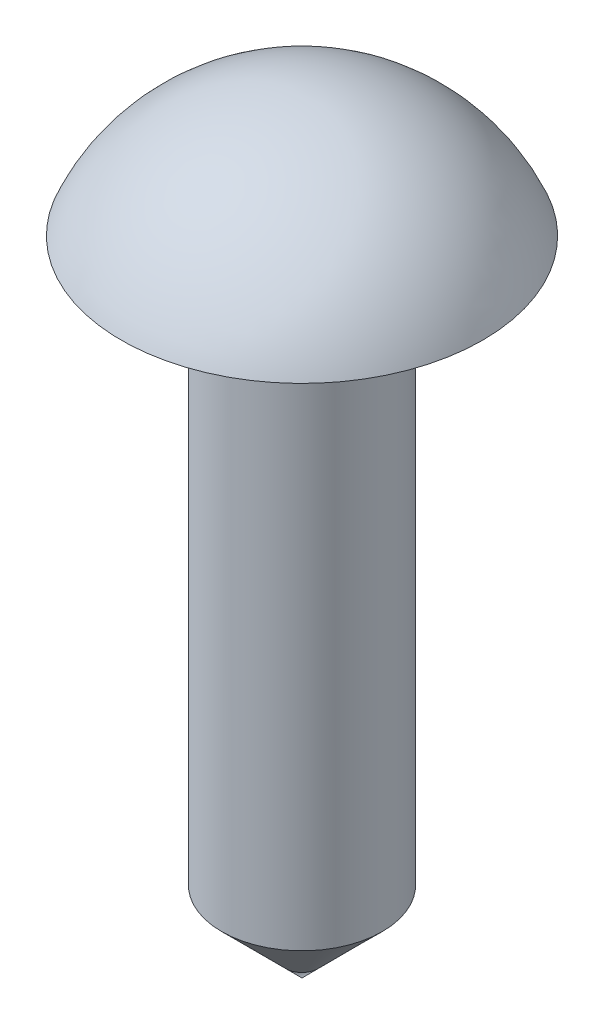
ISO-10303-21;
HEADER;
FILE_DESCRIPTION(('STEP AP214'),'2;1');
FILE_NAME('part.step','',(''),(''),'','','');
FILE_SCHEMA(('AUTOMOTIVE_DESIGN { 1 0 10303 214 1 1 1 1 }'));
ENDSEC;
DATA;
#1=APPLICATION_CONTEXT('core data for automotive mechanical design processes');
#2=APPLICATION_PROTOCOL_DEFINITION('international standard','automotive_design',2000,#1);
#3=PRODUCT_CONTEXT('',#1,'mechanical');
#4=PRODUCT('Part','Part','',(#3));
#5=PRODUCT_RELATED_PRODUCT_CATEGORY('part','',(#4));
#6=PRODUCT_DEFINITION_FORMATION('','',#4);
#7=PRODUCT_DEFINITION_CONTEXT('part definition',#1,'design');
#8=PRODUCT_DEFINITION('design','',#6,#7);
#9=PRODUCT_DEFINITION_SHAPE('','',#8);
#10=(LENGTH_UNIT() NAMED_UNIT(*) SI_UNIT(.MILLI.,.METRE.));
#11=(NAMED_UNIT(*) PLANE_ANGLE_UNIT() SI_UNIT($,.RADIAN.));
#12=(NAMED_UNIT(*) SI_UNIT($,.STERADIAN.) SOLID_ANGLE_UNIT());
#13=UNCERTAINTY_MEASURE_WITH_UNIT(LENGTH_MEASURE(1.E-05),#10,'distance_accuracy_value','');
#14=(GEOMETRIC_REPRESENTATION_CONTEXT(3) GLOBAL_UNCERTAINTY_ASSIGNED_CONTEXT((#13)) GLOBAL_UNIT_ASSIGNED_CONTEXT((#10,
#11,#12)) REPRESENTATION_CONTEXT('',''));
#15=CARTESIAN_POINT('',(0.,0.,0.));
#16=DIRECTION('',(0.,0.,1.));
#17=DIRECTION('',(1.,0.,0.));
#18=AXIS2_PLACEMENT_3D('',#15,#16,#17);
#19=CARTESIAN_POINT('',(2.03662392898836E-12,-593.724808213605,0.));
#20=DIRECTION('',(0.,-1.,0.));
#21=DIRECTION('',(1.,0.,0.));
#22=AXIS2_PLACEMENT_3D('',#19,#20,#21);
#23=CYLINDRICAL_SURFACE('',#22,1.);
#24=CARTESIAN_POINT('',(0.,-3.00000000000011,0.));
#25=DIRECTION('',(0.,-1.,0.));
#26=DIRECTION('',(1.,0.,0.));
#27=AXIS2_PLACEMENT_3D('',#24,#25,#26);
#28=CIRCLE('',#27,1.);
#29=CARTESIAN_POINT('',(1.00000000000001,-3.00000000000011,0.));
#30=VERTEX_POINT('',#29);
#31=EDGE_CURVE('E11',#30,#30,#28,.F.);
#32=ORIENTED_EDGE('',*,*,#31,.T.);
#33=EDGE_LOOP('',(#32));
#34=FACE_BOUND('',#33,.T.);
#35=CARTESIAN_POINT('',(0.,4.,0.));
#36=DIRECTION('',(0.,-1.,0.));
#37=DIRECTION('',(1.,0.,0.));
#38=AXIS2_PLACEMENT_3D('',#35,#36,#37);
#39=CIRCLE('',#38,1.00000000000001);
#40=CARTESIAN_POINT('',(1.,4.00000000000001,0.));
#41=VERTEX_POINT('',#40);
#42=EDGE_CURVE('E43',#41,#41,#39,.T.);
#43=ORIENTED_EDGE('',*,*,#42,.T.);
#44=EDGE_LOOP('',(#43));
#45=FACE_BOUND('',#44,.T.);
#46=ADVANCED_FACE('F35',(#34,#45),#23,.T.);
#47=CARTESIAN_POINT('',(1.,4.,0.));
#48=DIRECTION('',(0.,-1.,0.));
#49=DIRECTION('',(1.,0.,0.));
#50=AXIS2_PLACEMENT_3D('',#47,#48,#49);
#51=PLANE('',#50);
#52=CARTESIAN_POINT('',(0.,4.,0.));
#53=DIRECTION('',(0.,-1.,0.));
#54=DIRECTION('',(1.,0.,0.));
#55=AXIS2_PLACEMENT_3D('',#52,#53,#54);
#56=CIRCLE('',#55,2.25000000000001);
#57=CARTESIAN_POINT('',(2.25,4.00000000000001,0.));
#58=VERTEX_POINT('',#57);
#59=EDGE_CURVE('E67',#58,#58,#56,.T.);
#60=ORIENTED_EDGE('',*,*,#59,.T.);
#61=EDGE_LOOP('',(#60));
#62=FACE_BOUND('',#61,.T.);
#63=ORIENTED_EDGE('',*,*,#42,.F.);
#64=EDGE_LOOP('',(#63));
#65=FACE_BOUND('',#64,.T.);
#66=ADVANCED_FACE('F52',(#62,#65),#51,.T.);
#67=CARTESIAN_POINT('',(0.,3.0625,0.));
#68=DIRECTION('',(0.,-1.,0.));
#69=DIRECTION('',(1.,0.,0.));
#70=AXIS2_PLACEMENT_3D('',#67,#68,#69);
#71=SPHERICAL_SURFACE('',#70,2.4375);
#72=ORIENTED_EDGE('',*,*,#59,.F.);
#73=EDGE_LOOP('',(#72));
#74=FACE_BOUND('',#73,.T.);
#75=ADVANCED_FACE('F47',(#74),#71,.T.);
#76=CARTESIAN_POINT('',(0.,-3.00000000000011,0.));
#77=DIRECTION('',(0.,1.,0.));
#78=DIRECTION('',(-1.,0.,0.));
#79=AXIS2_PLACEMENT_3D('',#76,#77,#78);
#80=CONICAL_SURFACE('',#79,0.999999999999936,0.785398163397472);
#81=ORIENTED_EDGE('',*,*,#31,.F.);
#82=EDGE_LOOP('',(#81));
#83=FACE_BOUND('',#82,.T.);
#84=CARTESIAN_POINT('',(0.,-4.,0.));
#85=VERTEX_POINT('',#84);
#86=VERTEX_LOOP('',#85);
#87=FACE_BOUND('',#86,.T.);
#88=ADVANCED_FACE('F38',(#83,#87),#80,.T.);
#89=CLOSED_SHELL('',(#46,#66,#75,#88));
#90=MANIFOLD_SOLID_BREP('B2',#89);
#91=ADVANCED_BREP_SHAPE_REPRESENTATION('',(#18,#90),#14);
#92=SHAPE_DEFINITION_REPRESENTATION(#9,#91);
ENDSEC;
END-ISO-10303-21;
